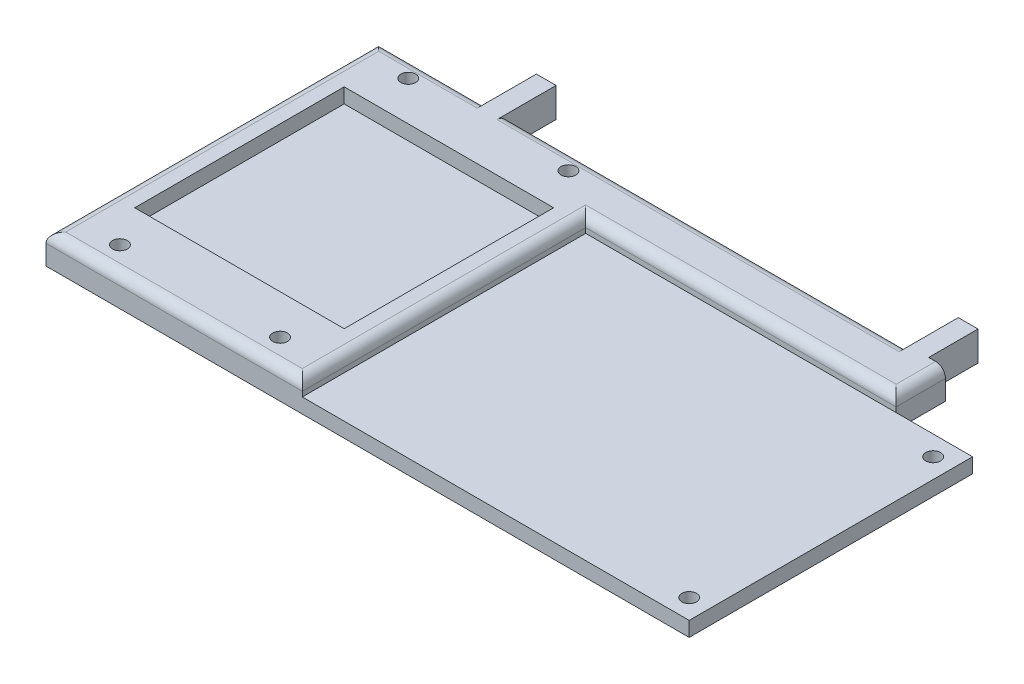
ISO-10303-21;
HEADER;
FILE_DESCRIPTION(('STEP AP214'),'2;1');
FILE_NAME('part.step','',(''),(''),'','','');
FILE_SCHEMA(('AUTOMOTIVE_DESIGN { 1 0 10303 214 1 1 1 1 }'));
ENDSEC;
DATA;
#1=APPLICATION_CONTEXT('core data for automotive mechanical design processes');
#2=APPLICATION_PROTOCOL_DEFINITION('international standard','automotive_design',2000,#1);
#3=PRODUCT_CONTEXT('',#1,'mechanical');
#4=PRODUCT('Part','Part','',(#3));
#5=PRODUCT_RELATED_PRODUCT_CATEGORY('part','',(#4));
#6=PRODUCT_DEFINITION_FORMATION('','',#4);
#7=PRODUCT_DEFINITION_CONTEXT('part definition',#1,'design');
#8=PRODUCT_DEFINITION('design','',#6,#7);
#9=PRODUCT_DEFINITION_SHAPE('','',#8);
#10=(LENGTH_UNIT() NAMED_UNIT(*) SI_UNIT(.MILLI.,.METRE.));
#11=(NAMED_UNIT(*) PLANE_ANGLE_UNIT() SI_UNIT($,.RADIAN.));
#12=(NAMED_UNIT(*) SI_UNIT($,.STERADIAN.) SOLID_ANGLE_UNIT());
#13=UNCERTAINTY_MEASURE_WITH_UNIT(LENGTH_MEASURE(1.E-05),#10,'distance_accuracy_value','');
#14=(GEOMETRIC_REPRESENTATION_CONTEXT(3) GLOBAL_UNCERTAINTY_ASSIGNED_CONTEXT((#13)) GLOBAL_UNIT_ASSIGNED_CONTEXT((#10,
#11,#12)) REPRESENTATION_CONTEXT('',''));
#15=CARTESIAN_POINT('',(0.,0.,0.));
#16=DIRECTION('',(0.,0.,1.));
#17=DIRECTION('',(1.,0.,0.));
#18=AXIS2_PLACEMENT_3D('',#15,#16,#17);
#19=CARTESIAN_POINT('',(0.,6.,0.));
#20=DIRECTION('',(-1.,0.,0.));
#21=DIRECTION('',(0.,0.,1.));
#22=AXIS2_PLACEMENT_3D('',#19,#20,#21);
#23=PLANE('',#22);
#24=DIRECTION('',(0.,-1.,0.));
#25=VECTOR('',#24,1.);
#26=CARTESIAN_POINT('',(0.,0.,10.));
#27=LINE('',#26,#25);
#28=CARTESIAN_POINT('',(0.,4.,10.));
#29=VERTEX_POINT('',#28);
#30=CARTESIAN_POINT('',(0.,3.,10.));
#31=VERTEX_POINT('',#30);
#32=EDGE_CURVE('E312',#29,#31,#27,.T.);
#33=ORIENTED_EDGE('',*,*,#32,.F.);
#34=DIRECTION('',(0.,0.,-1.));
#35=VECTOR('',#34,1.);
#36=CARTESIAN_POINT('',(0.,4.,0.));
#37=LINE('',#36,#35);
#38=CARTESIAN_POINT('',(0.,4.,67.5));
#39=VERTEX_POINT('',#38);
#40=EDGE_CURVE('E57',#29,#39,#37,.F.);
#41=ORIENTED_EDGE('',*,*,#40,.T.);
#42=DIRECTION('',(0.,-1.,0.));
#43=VECTOR('',#42,1.);
#44=CARTESIAN_POINT('',(0.,6.,67.5));
#45=LINE('',#44,#43);
#46=CARTESIAN_POINT('',(0.,3.,67.5));
#47=VERTEX_POINT('',#46);
#48=EDGE_CURVE('E222',#39,#47,#45,.T.);
#49=ORIENTED_EDGE('',*,*,#48,.T.);
#50=DIRECTION('',(0.,0.,1.));
#51=VECTOR('',#50,1.);
#52=CARTESIAN_POINT('',(0.,3.,0.));
#53=LINE('',#52,#51);
#54=EDGE_CURVE('E262',#31,#47,#53,.T.);
#55=ORIENTED_EDGE('',*,*,#54,.F.);
#56=EDGE_LOOP('',(#33,#41,#49,#55));
#57=FACE_BOUND('',#56,.T.);
#58=ADVANCED_FACE('F40',(#57),#23,.F.);
#59=CARTESIAN_POINT('',(63.,0.,9.99999999999999));
#60=DIRECTION('',(0.,0.,-1.));
#61=DIRECTION('',(0.,1.,0.));
#62=AXIS2_PLACEMENT_3D('',#59,#60,#61);
#63=PLANE('',#62);
#64=DIRECTION('',(0.,-1.,0.));
#65=VECTOR('',#64,1.);
#66=CARTESIAN_POINT('',(63.,0.,9.99999999999999));
#67=LINE('',#66,#65);
#68=CARTESIAN_POINT('',(63.,4.,9.99999999999999));
#69=VERTEX_POINT('',#68);
#70=CARTESIAN_POINT('',(63.,3.,9.99999999999999));
#71=VERTEX_POINT('',#70);
#72=EDGE_CURVE('E316',#69,#71,#67,.T.);
#73=ORIENTED_EDGE('',*,*,#72,.F.);
#74=DIRECTION('',(-1.,0.,0.));
#75=VECTOR('',#74,1.);
#76=CARTESIAN_POINT('',(63.,4.,9.99999999999999));
#77=LINE('',#76,#75);
#78=EDGE_CURVE('E65',#69,#29,#77,.T.);
#79=ORIENTED_EDGE('',*,*,#78,.T.);
#80=ORIENTED_EDGE('',*,*,#32,.T.);
#81=DIRECTION('',(-1.,0.,0.));
#82=VECTOR('',#81,1.);
#83=CARTESIAN_POINT('',(63.,3.,9.99999999999999));
#84=LINE('',#83,#82);
#85=EDGE_CURVE('E253',#71,#31,#84,.T.);
#86=ORIENTED_EDGE('',*,*,#85,.F.);
#87=EDGE_LOOP('',(#73,#79,#80,#86));
#88=FACE_BOUND('',#87,.T.);
#89=ADVANCED_FACE('F457',(#88),#63,.F.);
#90=CARTESIAN_POINT('',(0.,6.,0.));
#91=DIRECTION('',(0.,0.,1.));
#92=DIRECTION('',(1.,0.,0.));
#93=AXIS2_PLACEMENT_3D('',#90,#91,#92);
#94=PLANE('',#93);
#95=DIRECTION('',(0.,-1.,0.));
#96=VECTOR('',#95,1.);
#97=CARTESIAN_POINT('',(-26.,6.,0.));
#98=LINE('',#97,#96);
#99=CARTESIAN_POINT('',(-26.,4.,0.));
#100=VERTEX_POINT('',#99);
#101=CARTESIAN_POINT('',(-26.,0.,0.));
#102=VERTEX_POINT('',#101);
#103=EDGE_CURVE('E293',#100,#102,#98,.T.);
#104=ORIENTED_EDGE('',*,*,#103,.F.);
#105=DIRECTION('',(-1.,0.,0.));
#106=VECTOR('',#105,1.);
#107=CARTESIAN_POINT('',(0.,4.,0.));
#108=LINE('',#107,#106);
#109=CARTESIAN_POINT('',(55.6,4.,0.));
#110=VERTEX_POINT('',#109);
#111=EDGE_CURVE('E402',#100,#110,#108,.F.);
#112=ORIENTED_EDGE('',*,*,#111,.T.);
#113=DIRECTION('',(0.,1.,0.));
#114=VECTOR('',#113,1.);
#115=CARTESIAN_POINT('',(55.6,6.,0.));
#116=LINE('',#115,#114);
#117=CARTESIAN_POINT('',(55.6,0.,0.));
#118=VERTEX_POINT('',#117);
#119=EDGE_CURVE('E265',#118,#110,#116,.T.);
#120=ORIENTED_EDGE('',*,*,#119,.F.);
#121=DIRECTION('',(-1.,0.,0.));
#122=VECTOR('',#121,1.);
#123=CARTESIAN_POINT('',(0.,0.,0.));
#124=LINE('',#123,#122);
#125=EDGE_CURVE('E371',#118,#102,#124,.T.);
#126=ORIENTED_EDGE('',*,*,#125,.T.);
#127=EDGE_LOOP('',(#104,#112,#120,#126));
#128=FACE_BOUND('',#127,.T.);
#129=ADVANCED_FACE('F490',(#128),#94,.F.);
#130=DIRECTION('',(-1.,0.,0.));
#131=VECTOR('',#130,1.);
#132=CARTESIAN_POINT('',(0.,6.,0.));
#133=LINE('',#132,#131);
#134=CARTESIAN_POINT('',(61.,6.,0.));
#135=VERTEX_POINT('',#134);
#136=CARTESIAN_POINT('',(59.6,6.,0.));
#137=VERTEX_POINT('',#136);
#138=EDGE_CURVE('E232',#135,#137,#133,.T.);
#139=ORIENTED_EDGE('',*,*,#138,.F.);
#140=CARTESIAN_POINT('',(61.,4.,0.));
#141=DIRECTION('',(0.,0.,1.));
#142=DIRECTION('',(1.,0.,0.));
#143=AXIS2_PLACEMENT_3D('',#140,#141,#142);
#144=CIRCLE('',#143,2.);
#145=CARTESIAN_POINT('',(63.,4.,0.));
#146=VERTEX_POINT('',#145);
#147=EDGE_CURVE('E408',#135,#146,#144,.F.);
#148=ORIENTED_EDGE('',*,*,#147,.T.);
#149=DIRECTION('',(0.,1.,0.));
#150=VECTOR('',#149,1.);
#151=CARTESIAN_POINT('',(63.,0.,0.));
#152=LINE('',#151,#150);
#153=CARTESIAN_POINT('',(63.,0.,0.));
#154=VERTEX_POINT('',#153);
#155=EDGE_CURVE('E313',#154,#146,#152,.T.);
#156=ORIENTED_EDGE('',*,*,#155,.F.);
#157=CARTESIAN_POINT('',(59.6,0.,0.));
#158=VERTEX_POINT('',#157);
#159=EDGE_CURVE('E233',#154,#158,#124,.T.);
#160=ORIENTED_EDGE('',*,*,#159,.T.);
#161=DIRECTION('',(0.,-1.,0.));
#162=VECTOR('',#161,1.);
#163=CARTESIAN_POINT('',(59.6,6.,0.));
#164=LINE('',#163,#162);
#165=EDGE_CURVE('E269',#137,#158,#164,.T.);
#166=ORIENTED_EDGE('',*,*,#165,.F.);
#167=EDGE_LOOP('',(#139,#148,#156,#160,#166));
#168=FACE_BOUND('',#167,.T.);
#169=ADVANCED_FACE('F522',(#168),#94,.F.);
#170=DIRECTION('',(0.,-1.,0.));
#171=VECTOR('',#170,1.);
#172=CARTESIAN_POINT('',(-52.,6.,0.));
#173=LINE('',#172,#171);
#174=CARTESIAN_POINT('',(-52.,4.,0.));
#175=VERTEX_POINT('',#174);
#176=CARTESIAN_POINT('',(-52.,0.,0.));
#177=VERTEX_POINT('',#176);
#178=EDGE_CURVE('E228',#175,#177,#173,.T.);
#179=ORIENTED_EDGE('',*,*,#178,.F.);
#180=DIRECTION('',(-1.,0.,0.));
#181=VECTOR('',#180,1.);
#182=CARTESIAN_POINT('',(0.,4.,0.));
#183=LINE('',#182,#181);
#184=CARTESIAN_POINT('',(-30.,4.,0.));
#185=VERTEX_POINT('',#184);
#186=EDGE_CURVE('E400',#175,#185,#183,.F.);
#187=ORIENTED_EDGE('',*,*,#186,.T.);
#188=DIRECTION('',(0.,1.,0.));
#189=VECTOR('',#188,1.);
#190=CARTESIAN_POINT('',(-30.,6.,0.));
#191=LINE('',#190,#189);
#192=CARTESIAN_POINT('',(-30.,0.,0.));
#193=VERTEX_POINT('',#192);
#194=EDGE_CURVE('E289',#193,#185,#191,.T.);
#195=ORIENTED_EDGE('',*,*,#194,.F.);
#196=EDGE_CURVE('E362',#193,#177,#124,.T.);
#197=ORIENTED_EDGE('',*,*,#196,.T.);
#198=EDGE_LOOP('',(#179,#187,#195,#197));
#199=FACE_BOUND('',#198,.T.);
#200=ADVANCED_FACE('F475',(#199),#94,.F.);
#201=CARTESIAN_POINT('',(-52.,6.,0.));
#202=DIRECTION('',(1.,0.,0.));
#203=DIRECTION('',(0.,0.,-1.));
#204=AXIS2_PLACEMENT_3D('',#201,#202,#203);
#205=PLANE('',#204);
#206=DIRECTION('',(0.,-1.,0.));
#207=VECTOR('',#206,1.);
#208=CARTESIAN_POINT('',(-52.,6.,67.5));
#209=LINE('',#208,#207);
#210=CARTESIAN_POINT('',(-52.,4.,67.5));
#211=VERTEX_POINT('',#210);
#212=CARTESIAN_POINT('',(-52.,0.,67.5));
#213=VERTEX_POINT('',#212);
#214=EDGE_CURVE('E210',#211,#213,#209,.T.);
#215=ORIENTED_EDGE('',*,*,#214,.F.);
#216=DIRECTION('',(0.,0.,1.));
#217=VECTOR('',#216,1.);
#218=CARTESIAN_POINT('',(-52.,4.,0.));
#219=LINE('',#218,#217);
#220=EDGE_CURVE('E404',#211,#175,#219,.F.);
#221=ORIENTED_EDGE('',*,*,#220,.T.);
#222=ORIENTED_EDGE('',*,*,#178,.T.);
#223=DIRECTION('',(0.,0.,1.));
#224=VECTOR('',#223,1.);
#225=CARTESIAN_POINT('',(-52.,0.,0.));
#226=LINE('',#225,#224);
#227=EDGE_CURVE('E225',#177,#213,#226,.T.);
#228=ORIENTED_EDGE('',*,*,#227,.T.);
#229=EDGE_LOOP('',(#215,#221,#222,#228));
#230=FACE_BOUND('',#229,.T.);
#231=ADVANCED_FACE('F226',(#230),#205,.F.);
#232=CARTESIAN_POINT('',(0.,6.,0.));
#233=DIRECTION('',(0.,-1.,0.));
#234=DIRECTION('',(0.,0.,-1.));
#235=AXIS2_PLACEMENT_3D('',#232,#233,#234);
#236=PLANE('',#235);
#237=DIRECTION('',(-1.,0.,0.));
#238=VECTOR('',#237,1.);
#239=CARTESIAN_POINT('',(0.,6.,2.));
#240=LINE('',#239,#238);
#241=CARTESIAN_POINT('',(55.6,6.,1.99999999999999));
#242=VERTEX_POINT('',#241);
#243=CARTESIAN_POINT('',(-26.,6.,2.));
#244=VERTEX_POINT('',#243);
#245=EDGE_CURVE('E397',#242,#244,#240,.T.);
#246=ORIENTED_EDGE('',*,*,#245,.T.);
#247=DIRECTION('',(0.,0.,1.));
#248=VECTOR('',#247,1.);
#249=CARTESIAN_POINT('',(-26.,6.,-10.));
#250=LINE('',#249,#248);
#251=CARTESIAN_POINT('',(-26.,6.,-10.));
#252=VERTEX_POINT('',#251);
#253=EDGE_CURVE('E308',#252,#244,#250,.T.);
#254=ORIENTED_EDGE('',*,*,#253,.F.);
#255=DIRECTION('',(1.,0.,0.));
#256=VECTOR('',#255,1.);
#257=CARTESIAN_POINT('',(-30.,6.,-9.99999999999999));
#258=LINE('',#257,#256);
#259=CARTESIAN_POINT('',(-30.,6.,-9.99999999999999));
#260=VERTEX_POINT('',#259);
#261=EDGE_CURVE('E292',#260,#252,#258,.T.);
#262=ORIENTED_EDGE('',*,*,#261,.F.);
#263=DIRECTION('',(0.,0.,1.));
#264=VECTOR('',#263,1.);
#265=CARTESIAN_POINT('',(-30.,6.,-9.99999999999999));
#266=LINE('',#265,#264);
#267=CARTESIAN_POINT('',(-30.,6.,2.));
#268=VERTEX_POINT('',#267);
#269=EDGE_CURVE('E310',#260,#268,#266,.T.);
#270=ORIENTED_EDGE('',*,*,#269,.T.);
#271=DIRECTION('',(-1.,0.,0.));
#272=VECTOR('',#271,1.);
#273=CARTESIAN_POINT('',(0.,6.,2.));
#274=LINE('',#273,#272);
#275=CARTESIAN_POINT('',(-50.,6.,2.00000000000001));
#276=VERTEX_POINT('',#275);
#277=EDGE_CURVE('E394',#268,#276,#274,.T.);
#278=ORIENTED_EDGE('',*,*,#277,.T.);
#279=DIRECTION('',(0.,0.,1.));
#280=VECTOR('',#279,1.);
#281=CARTESIAN_POINT('',(-50.,6.,0.));
#282=LINE('',#281,#280);
#283=CARTESIAN_POINT('',(-50.,6.,65.5));
#284=VERTEX_POINT('',#283);
#285=EDGE_CURVE('E392',#276,#284,#282,.T.);
#286=ORIENTED_EDGE('',*,*,#285,.T.);
#287=DIRECTION('',(-1.,0.,0.));
#288=VECTOR('',#287,1.);
#289=CARTESIAN_POINT('',(0.,6.,65.5));
#290=LINE('',#289,#288);
#291=CARTESIAN_POINT('',(-1.99999999999999,6.,65.5));
#292=VERTEX_POINT('',#291);
#293=EDGE_CURVE('E374',#284,#292,#290,.F.);
#294=ORIENTED_EDGE('',*,*,#293,.T.);
#295=DIRECTION('',(0.,0.,-1.));
#296=VECTOR('',#295,1.);
#297=CARTESIAN_POINT('',(-2.,6.,0.));
#298=LINE('',#297,#296);
#299=CARTESIAN_POINT('',(-2.,6.,8.));
#300=VERTEX_POINT('',#299);
#301=EDGE_CURVE('E386',#292,#300,#298,.T.);
#302=ORIENTED_EDGE('',*,*,#301,.T.);
#303=DIRECTION('',(-1.,0.,0.));
#304=VECTOR('',#303,1.);
#305=CARTESIAN_POINT('',(0.,6.,8.));
#306=LINE('',#305,#304);
#307=CARTESIAN_POINT('',(61.,6.,7.99999999999999));
#308=VERTEX_POINT('',#307);
#309=EDGE_CURVE('E388',#300,#308,#306,.F.);
#310=ORIENTED_EDGE('',*,*,#309,.T.);
#311=DIRECTION('',(0.,0.,1.));
#312=VECTOR('',#311,1.);
#313=CARTESIAN_POINT('',(61.,6.,0.));
#314=LINE('',#313,#312);
#315=EDGE_CURVE('E390',#308,#135,#314,.F.);
#316=ORIENTED_EDGE('',*,*,#315,.T.);
#317=ORIENTED_EDGE('',*,*,#138,.T.);
#318=DIRECTION('',(0.,0.,1.));
#319=VECTOR('',#318,1.);
#320=CARTESIAN_POINT('',(59.6,6.,-10.));
#321=LINE('',#320,#319);
#322=CARTESIAN_POINT('',(59.6,6.,-10.));
#323=VERTEX_POINT('',#322);
#324=EDGE_CURVE('E284',#323,#137,#321,.T.);
#325=ORIENTED_EDGE('',*,*,#324,.F.);
#326=DIRECTION('',(1.,0.,0.));
#327=VECTOR('',#326,1.);
#328=CARTESIAN_POINT('',(55.6,6.,-10.));
#329=LINE('',#328,#327);
#330=CARTESIAN_POINT('',(55.6,6.,-10.));
#331=VERTEX_POINT('',#330);
#332=EDGE_CURVE('E268',#331,#323,#329,.T.);
#333=ORIENTED_EDGE('',*,*,#332,.F.);
#334=DIRECTION('',(0.,0.,1.));
#335=VECTOR('',#334,1.);
#336=CARTESIAN_POINT('',(55.6,6.,-10.));
#337=LINE('',#336,#335);
#338=EDGE_CURVE('E287',#331,#242,#337,.T.);
#339=ORIENTED_EDGE('',*,*,#338,.T.);
#340=EDGE_LOOP('',(#246,#254,#262,#270,#278,#286,#294,#302,#310,#316,#317,#325,#333,#339));
#341=FACE_BOUND('',#340,.T.);
#342=CARTESIAN_POINT('',(-42.25,6.,62.25));
#343=DIRECTION('',(0.,1.,0.));
#344=DIRECTION('',(0.,0.,-1.));
#345=AXIS2_PLACEMENT_3D('',#342,#343,#344);
#346=CIRCLE('',#345,1.50000000000001);
#347=CARTESIAN_POINT('',(-42.25,6.,60.75));
#348=VERTEX_POINT('',#347);
#349=EDGE_CURVE('E321',#348,#348,#346,.T.);
#350=ORIENTED_EDGE('',*,*,#349,.F.);
#351=EDGE_LOOP('',(#350));
#352=FACE_BOUND('',#351,.T.);
#353=CARTESIAN_POINT('',(-9.74999999999999,6.,62.25));
#354=DIRECTION('',(0.,1.,0.));
#355=DIRECTION('',(0.,0.,1.));
#356=AXIS2_PLACEMENT_3D('',#353,#354,#355);
#357=CIRCLE('',#356,1.50000000000001);
#358=CARTESIAN_POINT('',(-9.74999999999999,6.,63.75));
#359=VERTEX_POINT('',#358);
#360=EDGE_CURVE('E327',#359,#359,#357,.T.);
#361=ORIENTED_EDGE('',*,*,#360,.F.);
#362=EDGE_LOOP('',(#361));
#363=FACE_BOUND('',#362,.T.);
#364=CARTESIAN_POINT('',(-9.74999999999999,6.,3.75000000000001));
#365=DIRECTION('',(0.,1.,0.));
#366=DIRECTION('',(0.,0.,-1.));
#367=AXIS2_PLACEMENT_3D('',#364,#365,#366);
#368=CIRCLE('',#367,1.5);
#369=CARTESIAN_POINT('',(-9.74999999999999,6.,2.25000000000001));
#370=VERTEX_POINT('',#369);
#371=EDGE_CURVE('E323',#370,#370,#368,.T.);
#372=ORIENTED_EDGE('',*,*,#371,.F.);
#373=EDGE_LOOP('',(#372));
#374=FACE_BOUND('',#373,.T.);
#375=CARTESIAN_POINT('',(-42.25,6.,3.75000000000001));
#376=DIRECTION('',(0.,1.,0.));
#377=DIRECTION('',(0.,0.,1.));
#378=AXIS2_PLACEMENT_3D('',#375,#376,#377);
#379=CIRCLE('',#378,1.5);
#380=CARTESIAN_POINT('',(-42.25,6.,5.25000000000001));
#381=VERTEX_POINT('',#380);
#382=EDGE_CURVE('E326',#381,#381,#379,.T.);
#383=ORIENTED_EDGE('',*,*,#382,.F.);
#384=EDGE_LOOP('',(#383));
#385=FACE_BOUND('',#384,.T.);
#386=DIRECTION('',(1.,0.,0.));
#387=VECTOR('',#386,1.);
#388=CARTESIAN_POINT('',(-47.25,6.,54.25));
#389=LINE('',#388,#387);
#390=CARTESIAN_POINT('',(-47.25,6.,54.25));
#391=VERTEX_POINT('',#390);
#392=CARTESIAN_POINT('',(-4.74999999999998,6.,54.25));
#393=VERTEX_POINT('',#392);
#394=EDGE_CURVE('E351',#391,#393,#389,.T.);
#395=ORIENTED_EDGE('',*,*,#394,.F.);
#396=DIRECTION('',(0.,0.,1.));
#397=VECTOR('',#396,1.);
#398=CARTESIAN_POINT('',(-47.25,6.,11.75));
#399=LINE('',#398,#397);
#400=CARTESIAN_POINT('',(-47.25,6.,11.75));
#401=VERTEX_POINT('',#400);
#402=EDGE_CURVE('E349',#401,#391,#399,.T.);
#403=ORIENTED_EDGE('',*,*,#402,.F.);
#404=DIRECTION('',(-1.,0.,0.));
#405=VECTOR('',#404,1.);
#406=CARTESIAN_POINT('',(-47.25,6.,11.75));
#407=LINE('',#406,#405);
#408=CARTESIAN_POINT('',(-4.74999999999999,6.,11.75));
#409=VERTEX_POINT('',#408);
#410=EDGE_CURVE('E339',#409,#401,#407,.T.);
#411=ORIENTED_EDGE('',*,*,#410,.F.);
#412=DIRECTION('',(0.,0.,-1.));
#413=VECTOR('',#412,1.);
#414=CARTESIAN_POINT('',(-4.74999999999999,6.,11.75));
#415=LINE('',#414,#413);
#416=EDGE_CURVE('E355',#393,#409,#415,.T.);
#417=ORIENTED_EDGE('',*,*,#416,.F.);
#418=EDGE_LOOP('',(#395,#403,#411,#417));
#419=FACE_BOUND('',#418,.T.);
#420=ADVANCED_FACE('F503',(#341,#352,#363,#374,#385,#419),#236,.F.);
#421=CARTESIAN_POINT('',(0.,0.,0.));
#422=DIRECTION('',(0.,-1.,0.));
#423=DIRECTION('',(0.,0.,-1.));
#424=AXIS2_PLACEMENT_3D('',#421,#422,#423);
#425=PLANE('',#424);
#426=CARTESIAN_POINT('',(-42.25,0.,62.25));
#427=DIRECTION('',(0.,-1.,0.));
#428=DIRECTION('',(0.,0.,-1.));
#429=AXIS2_PLACEMENT_3D('',#426,#427,#428);
#430=CIRCLE('',#429,1.50000000000001);
#431=CARTESIAN_POINT('',(-42.25,0.,60.75));
#432=VERTEX_POINT('',#431);
#433=EDGE_CURVE('E352',#432,#432,#430,.T.);
#434=ORIENTED_EDGE('',*,*,#433,.F.);
#435=EDGE_LOOP('',(#434));
#436=FACE_BOUND('',#435,.T.);
#437=CARTESIAN_POINT('',(-9.74999999999999,0.,62.25));
#438=DIRECTION('',(0.,-1.,0.));
#439=DIRECTION('',(0.,0.,-1.));
#440=AXIS2_PLACEMENT_3D('',#437,#438,#439);
#441=CIRCLE('',#440,1.50000000000001);
#442=CARTESIAN_POINT('',(-9.74999999999999,0.,60.75));
#443=VERTEX_POINT('',#442);
#444=EDGE_CURVE('E380',#443,#443,#441,.T.);
#445=ORIENTED_EDGE('',*,*,#444,.F.);
#446=EDGE_LOOP('',(#445));
#447=FACE_BOUND('',#446,.T.);
#448=CARTESIAN_POINT('',(-9.74999999999999,0.,3.75000000000001));
#449=DIRECTION('',(0.,-1.,0.));
#450=DIRECTION('',(0.,0.,-1.));
#451=AXIS2_PLACEMENT_3D('',#448,#449,#450);
#452=CIRCLE('',#451,1.5);
#453=CARTESIAN_POINT('',(-9.74999999999999,0.,2.25000000000001));
#454=VERTEX_POINT('',#453);
#455=EDGE_CURVE('E377',#454,#454,#452,.T.);
#456=ORIENTED_EDGE('',*,*,#455,.F.);
#457=EDGE_LOOP('',(#456));
#458=FACE_BOUND('',#457,.T.);
#459=CARTESIAN_POINT('',(-42.25,0.,3.75000000000001));
#460=DIRECTION('',(0.,-1.,0.));
#461=DIRECTION('',(0.,0.,-1.));
#462=AXIS2_PLACEMENT_3D('',#459,#460,#461);
#463=CIRCLE('',#462,1.5);
#464=CARTESIAN_POINT('',(-42.25,0.,2.25000000000001));
#465=VERTEX_POINT('',#464);
#466=EDGE_CURVE('E334',#465,#465,#463,.T.);
#467=ORIENTED_EDGE('',*,*,#466,.F.);
#468=EDGE_LOOP('',(#467));
#469=FACE_BOUND('',#468,.T.);
#470=DIRECTION('',(1.,0.,0.));
#471=VECTOR('',#470,1.);
#472=CARTESIAN_POINT('',(0.,0.,67.5));
#473=LINE('',#472,#471);
#474=CARTESIAN_POINT('',(78.5,0.,67.5));
#475=VERTEX_POINT('',#474);
#476=EDGE_CURVE('E215',#213,#475,#473,.T.);
#477=ORIENTED_EDGE('',*,*,#476,.F.);
#478=ORIENTED_EDGE('',*,*,#227,.F.);
#479=ORIENTED_EDGE('',*,*,#196,.F.);
#480=DIRECTION('',(0.,0.,1.));
#481=VECTOR('',#480,1.);
#482=CARTESIAN_POINT('',(-30.,0.,-9.99999999999999));
#483=LINE('',#482,#481);
#484=CARTESIAN_POINT('',(-30.,0.,-9.99999999999999));
#485=VERTEX_POINT('',#484);
#486=EDGE_CURVE('E299',#485,#193,#483,.T.);
#487=ORIENTED_EDGE('',*,*,#486,.F.);
#488=DIRECTION('',(-1.,0.,0.));
#489=VECTOR('',#488,1.);
#490=CARTESIAN_POINT('',(-30.,0.,-9.99999999999999));
#491=LINE('',#490,#489);
#492=CARTESIAN_POINT('',(-26.,0.,-10.));
#493=VERTEX_POINT('',#492);
#494=EDGE_CURVE('E297',#493,#485,#491,.T.);
#495=ORIENTED_EDGE('',*,*,#494,.F.);
#496=DIRECTION('',(0.,0.,1.));
#497=VECTOR('',#496,1.);
#498=CARTESIAN_POINT('',(-26.,0.,-10.));
#499=LINE('',#498,#497);
#500=EDGE_CURVE('E305',#493,#102,#499,.T.);
#501=ORIENTED_EDGE('',*,*,#500,.T.);
#502=ORIENTED_EDGE('',*,*,#125,.F.);
#503=DIRECTION('',(0.,0.,1.));
#504=VECTOR('',#503,1.);
#505=CARTESIAN_POINT('',(55.6,0.,-10.));
#506=LINE('',#505,#504);
#507=CARTESIAN_POINT('',(55.6,0.,-10.));
#508=VERTEX_POINT('',#507);
#509=EDGE_CURVE('E275',#508,#118,#506,.T.);
#510=ORIENTED_EDGE('',*,*,#509,.F.);
#511=DIRECTION('',(-1.,0.,0.));
#512=VECTOR('',#511,1.);
#513=CARTESIAN_POINT('',(55.6,0.,-10.));
#514=LINE('',#513,#512);
#515=CARTESIAN_POINT('',(59.6,0.,-10.));
#516=VERTEX_POINT('',#515);
#517=EDGE_CURVE('E273',#516,#508,#514,.T.);
#518=ORIENTED_EDGE('',*,*,#517,.F.);
#519=DIRECTION('',(0.,0.,1.));
#520=VECTOR('',#519,1.);
#521=CARTESIAN_POINT('',(59.6,0.,-10.));
#522=LINE('',#521,#520);
#523=EDGE_CURVE('E281',#516,#158,#522,.T.);
#524=ORIENTED_EDGE('',*,*,#523,.T.);
#525=ORIENTED_EDGE('',*,*,#159,.F.);
#526=DIRECTION('',(0.,0.,-1.));
#527=VECTOR('',#526,1.);
#528=CARTESIAN_POINT('',(63.,0.,0.));
#529=LINE('',#528,#527);
#530=CARTESIAN_POINT('',(63.,0.,9.99999999999999));
#531=VERTEX_POINT('',#530);
#532=EDGE_CURVE('E318',#531,#154,#529,.T.);
#533=ORIENTED_EDGE('',*,*,#532,.F.);
#534=DIRECTION('',(1.,0.,0.));
#535=VECTOR('',#534,1.);
#536=CARTESIAN_POINT('',(0.,0.,10.));
#537=LINE('',#536,#535);
#538=CARTESIAN_POINT('',(78.5,0.,10.));
#539=VERTEX_POINT('',#538);
#540=EDGE_CURVE('E221',#531,#539,#537,.T.);
#541=ORIENTED_EDGE('',*,*,#540,.T.);
#542=DIRECTION('',(0.,0.,1.));
#543=VECTOR('',#542,1.);
#544=CARTESIAN_POINT('',(78.5,0.,0.));
#545=LINE('',#544,#543);
#546=EDGE_CURVE('E239',#539,#475,#545,.T.);
#547=ORIENTED_EDGE('',*,*,#546,.T.);
#548=EDGE_LOOP('',(#477,#478,#479,#487,#495,#501,#502,#510,#518,#524,#525,#533,#541,#547));
#549=FACE_BOUND('',#548,.T.);
#550=CARTESIAN_POINT('',(74.5,0.,14.));
#551=DIRECTION('',(0.,-1.,0.));
#552=DIRECTION('',(0.,0.,-1.));
#553=AXIS2_PLACEMENT_3D('',#550,#551,#552);
#554=CIRCLE('',#553,1.5);
#555=CARTESIAN_POINT('',(74.5,0.,12.5));
#556=VERTEX_POINT('',#555);
#557=EDGE_CURVE('E243',#556,#556,#554,.T.);
#558=ORIENTED_EDGE('',*,*,#557,.F.);
#559=EDGE_LOOP('',(#558));
#560=FACE_BOUND('',#559,.T.);
#561=CARTESIAN_POINT('',(74.5,0.,63.5));
#562=DIRECTION('',(0.,-1.,0.));
#563=DIRECTION('',(0.,0.,-1.));
#564=AXIS2_PLACEMENT_3D('',#561,#562,#563);
#565=CIRCLE('',#564,1.5);
#566=CARTESIAN_POINT('',(74.5,0.,62.));
#567=VERTEX_POINT('',#566);
#568=EDGE_CURVE('E240',#567,#567,#565,.T.);
#569=ORIENTED_EDGE('',*,*,#568,.F.);
#570=EDGE_LOOP('',(#569));
#571=FACE_BOUND('',#570,.T.);
#572=ADVANCED_FACE('F235',(#436,#447,#458,#469,#549,#560,#571),#425,.T.);
#573=CARTESIAN_POINT('',(-47.25,3.,11.75));
#574=DIRECTION('',(-1.,0.,0.));
#575=DIRECTION('',(0.,0.,1.));
#576=AXIS2_PLACEMENT_3D('',#573,#574,#575);
#577=PLANE('',#576);
#578=ORIENTED_EDGE('',*,*,#402,.T.);
#579=DIRECTION('',(0.,1.,0.));
#580=VECTOR('',#579,1.);
#581=CARTESIAN_POINT('',(-47.25,3.,54.25));
#582=LINE('',#581,#580);
#583=CARTESIAN_POINT('',(-47.25,3.,54.25));
#584=VERTEX_POINT('',#583);
#585=EDGE_CURVE('E348',#584,#391,#582,.T.);
#586=ORIENTED_EDGE('',*,*,#585,.F.);
#587=DIRECTION('',(0.,0.,1.));
#588=VECTOR('',#587,1.);
#589=CARTESIAN_POINT('',(-47.25,3.,11.75));
#590=LINE('',#589,#588);
#591=CARTESIAN_POINT('',(-47.25,3.,11.75));
#592=VERTEX_POINT('',#591);
#593=EDGE_CURVE('E335',#592,#584,#590,.T.);
#594=ORIENTED_EDGE('',*,*,#593,.F.);
#595=DIRECTION('',(0.,1.,0.));
#596=VECTOR('',#595,1.);
#597=CARTESIAN_POINT('',(-47.25,3.,11.75));
#598=LINE('',#597,#596);
#599=EDGE_CURVE('E360',#592,#401,#598,.T.);
#600=ORIENTED_EDGE('',*,*,#599,.T.);
#601=EDGE_LOOP('',(#578,#586,#594,#600));
#602=FACE_BOUND('',#601,.T.);
#603=ADVANCED_FACE('F622',(#602),#577,.F.);
#604=CARTESIAN_POINT('',(-47.25,3.,11.75));
#605=DIRECTION('',(0.,0.,-1.));
#606=DIRECTION('',(-1.,0.,0.));
#607=AXIS2_PLACEMENT_3D('',#604,#605,#606);
#608=PLANE('',#607);
#609=ORIENTED_EDGE('',*,*,#410,.T.);
#610=ORIENTED_EDGE('',*,*,#599,.F.);
#611=DIRECTION('',(-1.,0.,0.));
#612=VECTOR('',#611,1.);
#613=CARTESIAN_POINT('',(-47.25,3.,11.75));
#614=LINE('',#613,#612);
#615=CARTESIAN_POINT('',(-4.74999999999999,3.,11.75));
#616=VERTEX_POINT('',#615);
#617=EDGE_CURVE('E345',#616,#592,#614,.T.);
#618=ORIENTED_EDGE('',*,*,#617,.F.);
#619=DIRECTION('',(0.,1.,0.));
#620=VECTOR('',#619,1.);
#621=CARTESIAN_POINT('',(-4.74999999999999,3.,11.75));
#622=LINE('',#621,#620);
#623=EDGE_CURVE('E363',#616,#409,#622,.T.);
#624=ORIENTED_EDGE('',*,*,#623,.T.);
#625=EDGE_LOOP('',(#609,#610,#618,#624));
#626=FACE_BOUND('',#625,.T.);
#627=ADVANCED_FACE('F638',(#626),#608,.F.);
#628=CARTESIAN_POINT('',(-4.74999999999999,3.,11.75));
#629=DIRECTION('',(1.,0.,0.));
#630=DIRECTION('',(0.,0.,-1.));
#631=AXIS2_PLACEMENT_3D('',#628,#629,#630);
#632=PLANE('',#631);
#633=ORIENTED_EDGE('',*,*,#416,.T.);
#634=ORIENTED_EDGE('',*,*,#623,.F.);
#635=DIRECTION('',(0.,0.,-1.));
#636=VECTOR('',#635,1.);
#637=CARTESIAN_POINT('',(-4.74999999999999,3.,11.75));
#638=LINE('',#637,#636);
#639=CARTESIAN_POINT('',(-4.74999999999998,3.,54.25));
#640=VERTEX_POINT('',#639);
#641=EDGE_CURVE('E342',#640,#616,#638,.T.);
#642=ORIENTED_EDGE('',*,*,#641,.F.);
#643=DIRECTION('',(0.,1.,0.));
#644=VECTOR('',#643,1.);
#645=CARTESIAN_POINT('',(-4.74999999999998,3.,54.25));
#646=LINE('',#645,#644);
#647=EDGE_CURVE('E365',#640,#393,#646,.T.);
#648=ORIENTED_EDGE('',*,*,#647,.T.);
#649=EDGE_LOOP('',(#633,#634,#642,#648));
#650=FACE_BOUND('',#649,.T.);
#651=ADVANCED_FACE('F646',(#650),#632,.F.);
#652=CARTESIAN_POINT('',(-47.25,3.,54.25));
#653=DIRECTION('',(0.,0.,1.));
#654=DIRECTION('',(1.,0.,0.));
#655=AXIS2_PLACEMENT_3D('',#652,#653,#654);
#656=PLANE('',#655);
#657=ORIENTED_EDGE('',*,*,#394,.T.);
#658=ORIENTED_EDGE('',*,*,#647,.F.);
#659=DIRECTION('',(1.,0.,0.));
#660=VECTOR('',#659,1.);
#661=CARTESIAN_POINT('',(-47.25,3.,54.25));
#662=LINE('',#661,#660);
#663=EDGE_CURVE('E338',#584,#640,#662,.T.);
#664=ORIENTED_EDGE('',*,*,#663,.F.);
#665=ORIENTED_EDGE('',*,*,#585,.T.);
#666=EDGE_LOOP('',(#657,#658,#664,#665));
#667=FACE_BOUND('',#666,.T.);
#668=ADVANCED_FACE('F654',(#667),#656,.F.);
#669=CARTESIAN_POINT('',(0.,3.,0.));
#670=DIRECTION('',(0.,1.,0.));
#671=DIRECTION('',(0.,0.,1.));
#672=AXIS2_PLACEMENT_3D('',#669,#670,#671);
#673=PLANE('',#672);
#674=ORIENTED_EDGE('',*,*,#593,.T.);
#675=ORIENTED_EDGE('',*,*,#663,.T.);
#676=ORIENTED_EDGE('',*,*,#641,.T.);
#677=ORIENTED_EDGE('',*,*,#617,.T.);
#678=EDGE_LOOP('',(#674,#675,#676,#677));
#679=FACE_BOUND('',#678,.T.);
#680=ADVANCED_FACE('F662',(#679),#673,.T.);
#681=CARTESIAN_POINT('',(-42.25,-7.,3.75000000000001));
#682=DIRECTION('',(0.,1.,0.));
#683=DIRECTION('',(0.,0.,1.));
#684=AXIS2_PLACEMENT_3D('',#681,#682,#683);
#685=CYLINDRICAL_SURFACE('',#684,1.5);
#686=ORIENTED_EDGE('',*,*,#466,.T.);
#687=EDGE_LOOP('',(#686));
#688=FACE_BOUND('',#687,.T.);
#689=ORIENTED_EDGE('',*,*,#382,.T.);
#690=EDGE_LOOP('',(#689));
#691=FACE_BOUND('',#690,.T.);
#692=ADVANCED_FACE('F670',(#688,#691),#685,.F.);
#693=CARTESIAN_POINT('',(-9.74999999999999,-7.,3.75000000000001));
#694=DIRECTION('',(0.,1.,0.));
#695=DIRECTION('',(0.,0.,1.));
#696=AXIS2_PLACEMENT_3D('',#693,#694,#695);
#697=CYLINDRICAL_SURFACE('',#696,1.5);
#698=ORIENTED_EDGE('',*,*,#455,.T.);
#699=EDGE_LOOP('',(#698));
#700=FACE_BOUND('',#699,.T.);
#701=ORIENTED_EDGE('',*,*,#371,.T.);
#702=EDGE_LOOP('',(#701));
#703=FACE_BOUND('',#702,.T.);
#704=ADVANCED_FACE('F678',(#700,#703),#697,.F.);
#705=CARTESIAN_POINT('',(-9.74999999999999,-7.,62.25));
#706=DIRECTION('',(0.,1.,0.));
#707=DIRECTION('',(0.,0.,1.));
#708=AXIS2_PLACEMENT_3D('',#705,#706,#707);
#709=CYLINDRICAL_SURFACE('',#708,1.50000000000001);
#710=ORIENTED_EDGE('',*,*,#444,.T.);
#711=EDGE_LOOP('',(#710));
#712=FACE_BOUND('',#711,.T.);
#713=ORIENTED_EDGE('',*,*,#360,.T.);
#714=EDGE_LOOP('',(#713));
#715=FACE_BOUND('',#714,.T.);
#716=ADVANCED_FACE('F686',(#712,#715),#709,.F.);
#717=CARTESIAN_POINT('',(-42.25,-7.,62.25));
#718=DIRECTION('',(0.,1.,0.));
#719=DIRECTION('',(0.,0.,1.));
#720=AXIS2_PLACEMENT_3D('',#717,#718,#719);
#721=CYLINDRICAL_SURFACE('',#720,1.50000000000001);
#722=ORIENTED_EDGE('',*,*,#433,.T.);
#723=EDGE_LOOP('',(#722));
#724=FACE_BOUND('',#723,.T.);
#725=ORIENTED_EDGE('',*,*,#349,.T.);
#726=EDGE_LOOP('',(#725));
#727=FACE_BOUND('',#726,.T.);
#728=ADVANCED_FACE('F694',(#724,#727),#721,.F.);
#729=CARTESIAN_POINT('',(63.,0.,0.));
#730=DIRECTION('',(1.,0.,0.));
#731=DIRECTION('',(0.,0.,-1.));
#732=AXIS2_PLACEMENT_3D('',#729,#730,#731);
#733=PLANE('',#732);
#734=ORIENTED_EDGE('',*,*,#155,.T.);
#735=DIRECTION('',(0.,0.,1.));
#736=VECTOR('',#735,1.);
#737=CARTESIAN_POINT('',(63.,4.,9.99999999999999));
#738=LINE('',#737,#736);
#739=EDGE_CURVE('E406',#146,#69,#738,.T.);
#740=ORIENTED_EDGE('',*,*,#739,.T.);
#741=ORIENTED_EDGE('',*,*,#72,.T.);
#742=DIRECTION('',(0.,-1.,0.));
#743=VECTOR('',#742,1.);
#744=CARTESIAN_POINT('',(63.,3.,9.99999999999999));
#745=LINE('',#744,#743);
#746=EDGE_CURVE('E256',#71,#531,#745,.T.);
#747=ORIENTED_EDGE('',*,*,#746,.T.);
#748=ORIENTED_EDGE('',*,*,#532,.T.);
#749=EDGE_LOOP('',(#734,#740,#741,#747,#748));
#750=FACE_BOUND('',#749,.T.);
#751=ADVANCED_FACE('F453',(#750),#733,.T.);
#752=CARTESIAN_POINT('',(-30.,6.,-9.99999999999999));
#753=DIRECTION('',(1.,0.,0.));
#754=DIRECTION('',(0.,1.,0.));
#755=AXIS2_PLACEMENT_3D('',#752,#753,#754);
#756=PLANE('',#755);
#757=ORIENTED_EDGE('',*,*,#194,.T.);
#758=CARTESIAN_POINT('',(-30.,4.,2.));
#759=DIRECTION('',(1.,0.,0.));
#760=DIRECTION('',(0.,1.,0.));
#761=AXIS2_PLACEMENT_3D('',#758,#759,#760);
#762=CIRCLE('',#761,2.);
#763=EDGE_CURVE('E413',#185,#268,#762,.T.);
#764=ORIENTED_EDGE('',*,*,#763,.T.);
#765=ORIENTED_EDGE('',*,*,#269,.F.);
#766=DIRECTION('',(0.,1.,0.));
#767=VECTOR('',#766,1.);
#768=CARTESIAN_POINT('',(-30.,6.,-9.99999999999999));
#769=LINE('',#768,#767);
#770=EDGE_CURVE('E290',#485,#260,#769,.T.);
#771=ORIENTED_EDGE('',*,*,#770,.F.);
#772=ORIENTED_EDGE('',*,*,#486,.T.);
#773=EDGE_LOOP('',(#757,#764,#765,#771,#772));
#774=FACE_BOUND('',#773,.T.);
#775=ADVANCED_FACE('F482',(#774),#756,.F.);
#776=CARTESIAN_POINT('',(-26.,6.,-10.));
#777=DIRECTION('',(-1.,0.,0.));
#778=DIRECTION('',(0.,-1.,0.));
#779=AXIS2_PLACEMENT_3D('',#776,#777,#778);
#780=PLANE('',#779);
#781=ORIENTED_EDGE('',*,*,#500,.F.);
#782=DIRECTION('',(0.,-1.,0.));
#783=VECTOR('',#782,1.);
#784=CARTESIAN_POINT('',(-26.,6.,-10.));
#785=LINE('',#784,#783);
#786=EDGE_CURVE('E295',#252,#493,#785,.T.);
#787=ORIENTED_EDGE('',*,*,#786,.F.);
#788=ORIENTED_EDGE('',*,*,#253,.T.);
#789=CARTESIAN_POINT('',(-26.,4.,2.));
#790=DIRECTION('',(-1.,0.,0.));
#791=DIRECTION('',(0.,-1.,0.));
#792=AXIS2_PLACEMENT_3D('',#789,#790,#791);
#793=CIRCLE('',#792,2.);
#794=EDGE_CURVE('E49',#244,#100,#793,.T.);
#795=ORIENTED_EDGE('',*,*,#794,.T.);
#796=ORIENTED_EDGE('',*,*,#103,.T.);
#797=EDGE_LOOP('',(#781,#787,#788,#795,#796));
#798=FACE_BOUND('',#797,.T.);
#799=ADVANCED_FACE('F496',(#798),#780,.F.);
#800=CARTESIAN_POINT('',(0.,0.,-10.));
#801=DIRECTION('',(0.,0.,1.));
#802=DIRECTION('',(1.,0.,0.));
#803=AXIS2_PLACEMENT_3D('',#800,#801,#802);
#804=PLANE('',#803);
#805=ORIENTED_EDGE('',*,*,#770,.T.);
#806=ORIENTED_EDGE('',*,*,#261,.T.);
#807=ORIENTED_EDGE('',*,*,#786,.T.);
#808=ORIENTED_EDGE('',*,*,#494,.T.);
#809=EDGE_LOOP('',(#805,#806,#807,#808));
#810=FACE_BOUND('',#809,.T.);
#811=ADVANCED_FACE('F524',(#810),#804,.F.);
#812=CARTESIAN_POINT('',(55.6,6.,-10.));
#813=DIRECTION('',(1.,0.,0.));
#814=DIRECTION('',(0.,0.,-1.));
#815=AXIS2_PLACEMENT_3D('',#812,#813,#814);
#816=PLANE('',#815);
#817=ORIENTED_EDGE('',*,*,#119,.T.);
#818=CARTESIAN_POINT('',(55.6,4.,1.99999999999999));
#819=DIRECTION('',(1.,0.,0.));
#820=DIRECTION('',(0.,0.,-1.));
#821=AXIS2_PLACEMENT_3D('',#818,#819,#820);
#822=CIRCLE('',#821,2.);
#823=EDGE_CURVE('E11',#110,#242,#822,.T.);
#824=ORIENTED_EDGE('',*,*,#823,.T.);
#825=ORIENTED_EDGE('',*,*,#338,.F.);
#826=DIRECTION('',(0.,1.,0.));
#827=VECTOR('',#826,1.);
#828=CARTESIAN_POINT('',(55.6,6.,-10.));
#829=LINE('',#828,#827);
#830=EDGE_CURVE('E266',#508,#331,#829,.T.);
#831=ORIENTED_EDGE('',*,*,#830,.F.);
#832=ORIENTED_EDGE('',*,*,#509,.T.);
#833=EDGE_LOOP('',(#817,#824,#825,#831,#832));
#834=FACE_BOUND('',#833,.T.);
#835=ADVANCED_FACE('F511',(#834),#816,.F.);
#836=CARTESIAN_POINT('',(59.6,6.,-10.));
#837=DIRECTION('',(-1.,0.,0.));
#838=DIRECTION('',(0.,0.,1.));
#839=AXIS2_PLACEMENT_3D('',#836,#837,#838);
#840=PLANE('',#839);
#841=ORIENTED_EDGE('',*,*,#523,.F.);
#842=DIRECTION('',(0.,-1.,0.));
#843=VECTOR('',#842,1.);
#844=CARTESIAN_POINT('',(59.6,6.,-10.));
#845=LINE('',#844,#843);
#846=EDGE_CURVE('E271',#323,#516,#845,.T.);
#847=ORIENTED_EDGE('',*,*,#846,.F.);
#848=ORIENTED_EDGE('',*,*,#324,.T.);
#849=ORIENTED_EDGE('',*,*,#165,.T.);
#850=EDGE_LOOP('',(#841,#847,#848,#849));
#851=FACE_BOUND('',#850,.T.);
#852=ADVANCED_FACE('F518',(#851),#840,.F.);
#853=CARTESIAN_POINT('',(0.,0.,-10.));
#854=DIRECTION('',(0.,0.,1.));
#855=DIRECTION('',(1.,0.,0.));
#856=AXIS2_PLACEMENT_3D('',#853,#854,#855);
#857=PLANE('',#856);
#858=ORIENTED_EDGE('',*,*,#830,.T.);
#859=ORIENTED_EDGE('',*,*,#332,.T.);
#860=ORIENTED_EDGE('',*,*,#846,.T.);
#861=ORIENTED_EDGE('',*,*,#517,.T.);
#862=EDGE_LOOP('',(#858,#859,#860,#861));
#863=FACE_BOUND('',#862,.T.);
#864=ADVANCED_FACE('F515',(#863),#857,.F.);
#865=CARTESIAN_POINT('',(0.,3.,0.));
#866=DIRECTION('',(0.,-1.,0.));
#867=DIRECTION('',(0.,0.,-1.));
#868=AXIS2_PLACEMENT_3D('',#865,#866,#867);
#869=PLANE('',#868);
#870=CARTESIAN_POINT('',(74.5,3.,14.));
#871=DIRECTION('',(0.,-1.,0.));
#872=DIRECTION('',(0.,0.,-1.));
#873=AXIS2_PLACEMENT_3D('',#870,#871,#872);
#874=CIRCLE('',#873,1.5);
#875=CARTESIAN_POINT('',(74.5,3.,12.5));
#876=VERTEX_POINT('',#875);
#877=EDGE_CURVE('E259',#876,#876,#874,.T.);
#878=ORIENTED_EDGE('',*,*,#877,.T.);
#879=EDGE_LOOP('',(#878));
#880=FACE_BOUND('',#879,.T.);
#881=CARTESIAN_POINT('',(74.5,3.,63.5));
#882=DIRECTION('',(0.,-1.,0.));
#883=DIRECTION('',(0.,0.,-1.));
#884=AXIS2_PLACEMENT_3D('',#881,#882,#883);
#885=CIRCLE('',#884,1.5);
#886=CARTESIAN_POINT('',(74.5,3.,62.));
#887=VERTEX_POINT('',#886);
#888=EDGE_CURVE('E443',#887,#887,#885,.T.);
#889=ORIENTED_EDGE('',*,*,#888,.T.);
#890=EDGE_LOOP('',(#889));
#891=FACE_BOUND('',#890,.T.);
#892=ORIENTED_EDGE('',*,*,#85,.T.);
#893=ORIENTED_EDGE('',*,*,#54,.T.);
#894=DIRECTION('',(1.,0.,0.));
#895=VECTOR('',#894,1.);
#896=CARTESIAN_POINT('',(0.,3.,67.5));
#897=LINE('',#896,#895);
#898=CARTESIAN_POINT('',(78.5,3.,67.5));
#899=VERTEX_POINT('',#898);
#900=EDGE_CURVE('E441',#47,#899,#897,.T.);
#901=ORIENTED_EDGE('',*,*,#900,.T.);
#902=DIRECTION('',(0.,0.,1.));
#903=VECTOR('',#902,1.);
#904=CARTESIAN_POINT('',(78.5,3.,0.));
#905=LINE('',#904,#903);
#906=CARTESIAN_POINT('',(78.5,3.,10.));
#907=VERTEX_POINT('',#906);
#908=EDGE_CURVE('E438',#907,#899,#905,.T.);
#909=ORIENTED_EDGE('',*,*,#908,.F.);
#910=DIRECTION('',(1.,0.,0.));
#911=VECTOR('',#910,1.);
#912=CARTESIAN_POINT('',(0.,3.,10.));
#913=LINE('',#912,#911);
#914=EDGE_CURVE('E250',#71,#907,#913,.T.);
#915=ORIENTED_EDGE('',*,*,#914,.F.);
#916=EDGE_LOOP('',(#892,#893,#901,#909,#915));
#917=FACE_BOUND('',#916,.T.);
#918=ADVANCED_FACE('F569',(#880,#891,#917),#869,.F.);
#919=CARTESIAN_POINT('',(0.,3.,67.5));
#920=DIRECTION('',(0.,0.,-1.));
#921=DIRECTION('',(-1.,0.,0.));
#922=AXIS2_PLACEMENT_3D('',#919,#920,#921);
#923=PLANE('',#922);
#924=ORIENTED_EDGE('',*,*,#48,.F.);
#925=DIRECTION('',(-1.,0.,0.));
#926=VECTOR('',#925,1.);
#927=CARTESIAN_POINT('',(0.,4.,67.5));
#928=LINE('',#927,#926);
#929=EDGE_CURVE('E218',#39,#211,#928,.T.);
#930=ORIENTED_EDGE('',*,*,#929,.T.);
#931=ORIENTED_EDGE('',*,*,#214,.T.);
#932=ORIENTED_EDGE('',*,*,#476,.T.);
#933=DIRECTION('',(0.,-1.,0.));
#934=VECTOR('',#933,1.);
#935=CARTESIAN_POINT('',(78.5,3.,67.5));
#936=LINE('',#935,#934);
#937=EDGE_CURVE('E251',#899,#475,#936,.T.);
#938=ORIENTED_EDGE('',*,*,#937,.F.);
#939=ORIENTED_EDGE('',*,*,#900,.F.);
#940=EDGE_LOOP('',(#924,#930,#931,#932,#938,#939));
#941=FACE_BOUND('',#940,.T.);
#942=ADVANCED_FACE('F212',(#941),#923,.F.);
#943=CARTESIAN_POINT('',(78.5,3.,0.));
#944=DIRECTION('',(1.,0.,0.));
#945=DIRECTION('',(0.,0.,-1.));
#946=AXIS2_PLACEMENT_3D('',#943,#944,#945);
#947=PLANE('',#946);
#948=ORIENTED_EDGE('',*,*,#546,.F.);
#949=DIRECTION('',(0.,-1.,0.));
#950=VECTOR('',#949,1.);
#951=CARTESIAN_POINT('',(78.5,3.,10.));
#952=LINE('',#951,#950);
#953=EDGE_CURVE('E254',#907,#539,#952,.T.);
#954=ORIENTED_EDGE('',*,*,#953,.F.);
#955=ORIENTED_EDGE('',*,*,#908,.T.);
#956=ORIENTED_EDGE('',*,*,#937,.T.);
#957=EDGE_LOOP('',(#948,#954,#955,#956));
#958=FACE_BOUND('',#957,.T.);
#959=ADVANCED_FACE('F565',(#958),#947,.T.);
#960=CARTESIAN_POINT('',(74.5,3.,14.));
#961=DIRECTION('',(0.,-1.,0.));
#962=DIRECTION('',(0.,0.,-1.));
#963=AXIS2_PLACEMENT_3D('',#960,#961,#962);
#964=CYLINDRICAL_SURFACE('',#963,1.5);
#965=ORIENTED_EDGE('',*,*,#877,.F.);
#966=EDGE_LOOP('',(#965));
#967=FACE_BOUND('',#966,.T.);
#968=ORIENTED_EDGE('',*,*,#557,.T.);
#969=EDGE_LOOP('',(#968));
#970=FACE_BOUND('',#969,.T.);
#971=ADVANCED_FACE('F560',(#967,#970),#964,.F.);
#972=CARTESIAN_POINT('',(74.5,3.,63.5));
#973=DIRECTION('',(0.,-1.,0.));
#974=DIRECTION('',(0.,0.,-1.));
#975=AXIS2_PLACEMENT_3D('',#972,#973,#974);
#976=CYLINDRICAL_SURFACE('',#975,1.5);
#977=ORIENTED_EDGE('',*,*,#888,.F.);
#978=EDGE_LOOP('',(#977));
#979=FACE_BOUND('',#978,.T.);
#980=ORIENTED_EDGE('',*,*,#568,.T.);
#981=EDGE_LOOP('',(#980));
#982=FACE_BOUND('',#981,.T.);
#983=ADVANCED_FACE('F555',(#979,#982),#976,.F.);
#984=CARTESIAN_POINT('',(0.,3.,10.));
#985=DIRECTION('',(0.,0.,-1.));
#986=DIRECTION('',(-1.,0.,0.));
#987=AXIS2_PLACEMENT_3D('',#984,#985,#986);
#988=PLANE('',#987);
#989=ORIENTED_EDGE('',*,*,#540,.F.);
#990=ORIENTED_EDGE('',*,*,#746,.F.);
#991=ORIENTED_EDGE('',*,*,#914,.T.);
#992=ORIENTED_EDGE('',*,*,#953,.T.);
#993=EDGE_LOOP('',(#989,#990,#991,#992));
#994=FACE_BOUND('',#993,.T.);
#995=ADVANCED_FACE('F450',(#994),#988,.T.);
#996=CARTESIAN_POINT('',(61.,4.,0.));
#997=DIRECTION('',(0.,0.,-1.));
#998=DIRECTION('',(-1.,0.,0.));
#999=AXIS2_PLACEMENT_3D('',#996,#997,#998);
#1000=CYLINDRICAL_SURFACE('',#999,2.);
#1001=ORIENTED_EDGE('',*,*,#147,.F.);
#1002=ORIENTED_EDGE('',*,*,#315,.F.);
#1003=CARTESIAN_POINT('',(61.,4.,7.99999999999999));
#1004=DIRECTION('',(-0.707106781186547,0.,0.707106781186548));
#1005=DIRECTION('',(-0.707106781186548,0.,-0.707106781186547));
#1006=AXIS2_PLACEMENT_3D('',#1003,#1004,#1005);
#1007=ELLIPSE('',#1006,2.82842712474619,2.);
#1008=EDGE_CURVE('E44',#69,#308,#1007,.T.);
#1009=ORIENTED_EDGE('',*,*,#1008,.F.);
#1010=ORIENTED_EDGE('',*,*,#739,.F.);
#1011=EDGE_LOOP('',(#1001,#1002,#1009,#1010));
#1012=FACE_BOUND('',#1011,.T.);
#1013=ADVANCED_FACE('F461',(#1012),#1000,.T.);
#1014=CARTESIAN_POINT('',(63.,4.,7.99999999999999));
#1015=DIRECTION('',(-1.,0.,0.));
#1016=DIRECTION('',(0.,0.,1.));
#1017=AXIS2_PLACEMENT_3D('',#1014,#1015,#1016);
#1018=CYLINDRICAL_SURFACE('',#1017,2.);
#1019=ORIENTED_EDGE('',*,*,#1008,.T.);
#1020=ORIENTED_EDGE('',*,*,#309,.F.);
#1021=CARTESIAN_POINT('',(-2.,4.,8.));
#1022=DIRECTION('',(-0.707106781186547,0.,0.707106781186548));
#1023=DIRECTION('',(-0.707106781186548,0.,-0.707106781186547));
#1024=AXIS2_PLACEMENT_3D('',#1021,#1022,#1023);
#1025=ELLIPSE('',#1024,2.82842712474619,2.);
#1026=EDGE_CURVE('E424',#29,#300,#1025,.T.);
#1027=ORIENTED_EDGE('',*,*,#1026,.F.);
#1028=ORIENTED_EDGE('',*,*,#78,.F.);
#1029=EDGE_LOOP('',(#1019,#1020,#1027,#1028));
#1030=FACE_BOUND('',#1029,.T.);
#1031=ADVANCED_FACE('F462',(#1030),#1018,.T.);
#1032=CARTESIAN_POINT('',(-2.,4.,0.));
#1033=DIRECTION('',(0.,0.,-1.));
#1034=DIRECTION('',(-1.,0.,0.));
#1035=AXIS2_PLACEMENT_3D('',#1032,#1033,#1034);
#1036=CYLINDRICAL_SURFACE('',#1035,2.);
#1037=ORIENTED_EDGE('',*,*,#1026,.T.);
#1038=ORIENTED_EDGE('',*,*,#301,.F.);
#1039=CARTESIAN_POINT('',(-1.99999999999999,4.,65.5));
#1040=DIRECTION('',(-0.707106781186548,0.,0.707106781186548));
#1041=DIRECTION('',(-0.707106781186547,0.,-0.707106781186547));
#1042=AXIS2_PLACEMENT_3D('',#1039,#1040,#1041);
#1043=ELLIPSE('',#1042,2.82842712474619,2.);
#1044=EDGE_CURVE('E422',#39,#292,#1043,.T.);
#1045=ORIENTED_EDGE('',*,*,#1044,.F.);
#1046=ORIENTED_EDGE('',*,*,#40,.F.);
#1047=EDGE_LOOP('',(#1037,#1038,#1045,#1046));
#1048=FACE_BOUND('',#1047,.T.);
#1049=ADVANCED_FACE('F464',(#1048),#1036,.T.);
#1050=CARTESIAN_POINT('',(0.,4.,65.5));
#1051=DIRECTION('',(-1.,0.,0.));
#1052=DIRECTION('',(0.,0.,1.));
#1053=AXIS2_PLACEMENT_3D('',#1050,#1051,#1052);
#1054=CYLINDRICAL_SURFACE('',#1053,2.);
#1055=ORIENTED_EDGE('',*,*,#1044,.T.);
#1056=ORIENTED_EDGE('',*,*,#293,.F.);
#1057=CARTESIAN_POINT('',(-50.,4.,65.5));
#1058=DIRECTION('',(-0.707106781186547,0.,-0.707106781186548));
#1059=DIRECTION('',(-0.707106781186548,0.,0.707106781186547));
#1060=AXIS2_PLACEMENT_3D('',#1057,#1058,#1059);
#1061=ELLIPSE('',#1060,2.82842712474619,2.);
#1062=EDGE_CURVE('E419',#211,#284,#1061,.T.);
#1063=ORIENTED_EDGE('',*,*,#1062,.F.);
#1064=ORIENTED_EDGE('',*,*,#929,.F.);
#1065=EDGE_LOOP('',(#1055,#1056,#1063,#1064));
#1066=FACE_BOUND('',#1065,.T.);
#1067=ADVANCED_FACE('F467',(#1066),#1054,.T.);
#1068=CARTESIAN_POINT('',(-50.,4.,0.));
#1069=DIRECTION('',(0.,0.,1.));
#1070=DIRECTION('',(1.,0.,0.));
#1071=AXIS2_PLACEMENT_3D('',#1068,#1069,#1070);
#1072=CYLINDRICAL_SURFACE('',#1071,2.);
#1073=ORIENTED_EDGE('',*,*,#1062,.T.);
#1074=ORIENTED_EDGE('',*,*,#285,.F.);
#1075=CARTESIAN_POINT('',(-50.,4.,2.00000000000001));
#1076=DIRECTION('',(-0.707106781186547,0.,0.707106781186548));
#1077=DIRECTION('',(0.707106781186548,0.,0.707106781186547));
#1078=AXIS2_PLACEMENT_3D('',#1075,#1076,#1077);
#1079=ELLIPSE('',#1078,2.82842712474619,2.);
#1080=EDGE_CURVE('E417',#175,#276,#1079,.F.);
#1081=ORIENTED_EDGE('',*,*,#1080,.F.);
#1082=ORIENTED_EDGE('',*,*,#220,.F.);
#1083=EDGE_LOOP('',(#1073,#1074,#1081,#1082));
#1084=FACE_BOUND('',#1083,.T.);
#1085=ADVANCED_FACE('F472',(#1084),#1072,.T.);
#1086=CARTESIAN_POINT('',(0.,4.,2.));
#1087=DIRECTION('',(-1.,0.,0.));
#1088=DIRECTION('',(0.,0.,1.));
#1089=AXIS2_PLACEMENT_3D('',#1086,#1087,#1088);
#1090=CYLINDRICAL_SURFACE('',#1089,2.);
#1091=ORIENTED_EDGE('',*,*,#763,.F.);
#1092=ORIENTED_EDGE('',*,*,#186,.F.);
#1093=ORIENTED_EDGE('',*,*,#1080,.T.);
#1094=ORIENTED_EDGE('',*,*,#277,.F.);
#1095=EDGE_LOOP('',(#1091,#1092,#1093,#1094));
#1096=FACE_BOUND('',#1095,.T.);
#1097=ADVANCED_FACE('F478',(#1096),#1090,.T.);
#1098=CARTESIAN_POINT('',(0.,4.,2.));
#1099=DIRECTION('',(-1.,0.,0.));
#1100=DIRECTION('',(0.,0.,1.));
#1101=AXIS2_PLACEMENT_3D('',#1098,#1099,#1100);
#1102=CYLINDRICAL_SURFACE('',#1101,2.);
#1103=ORIENTED_EDGE('',*,*,#823,.F.);
#1104=ORIENTED_EDGE('',*,*,#111,.F.);
#1105=ORIENTED_EDGE('',*,*,#794,.F.);
#1106=ORIENTED_EDGE('',*,*,#245,.F.);
#1107=EDGE_LOOP('',(#1103,#1104,#1105,#1106));
#1108=FACE_BOUND('',#1107,.T.);
#1109=ADVANCED_FACE('F42',(#1108),#1102,.T.);
#1110=CLOSED_SHELL('',(#58,#89,#129,#169,#200,#231,#420,#572,#603,#627,#651,#668,#680,#692,#704,
#716,#728,#751,#775,#799,#811,#835,#852,#864,#918,#942,#959,#971,#983,#995,#1013,#1031,#1049,
#1067,#1085,#1097,#1109));
#1111=MANIFOLD_SOLID_BREP('B2',#1110);
#1112=ADVANCED_BREP_SHAPE_REPRESENTATION('',(#18,#1111),#14);
#1113=SHAPE_DEFINITION_REPRESENTATION(#9,#1112);
ENDSEC;
END-ISO-10303-21;
